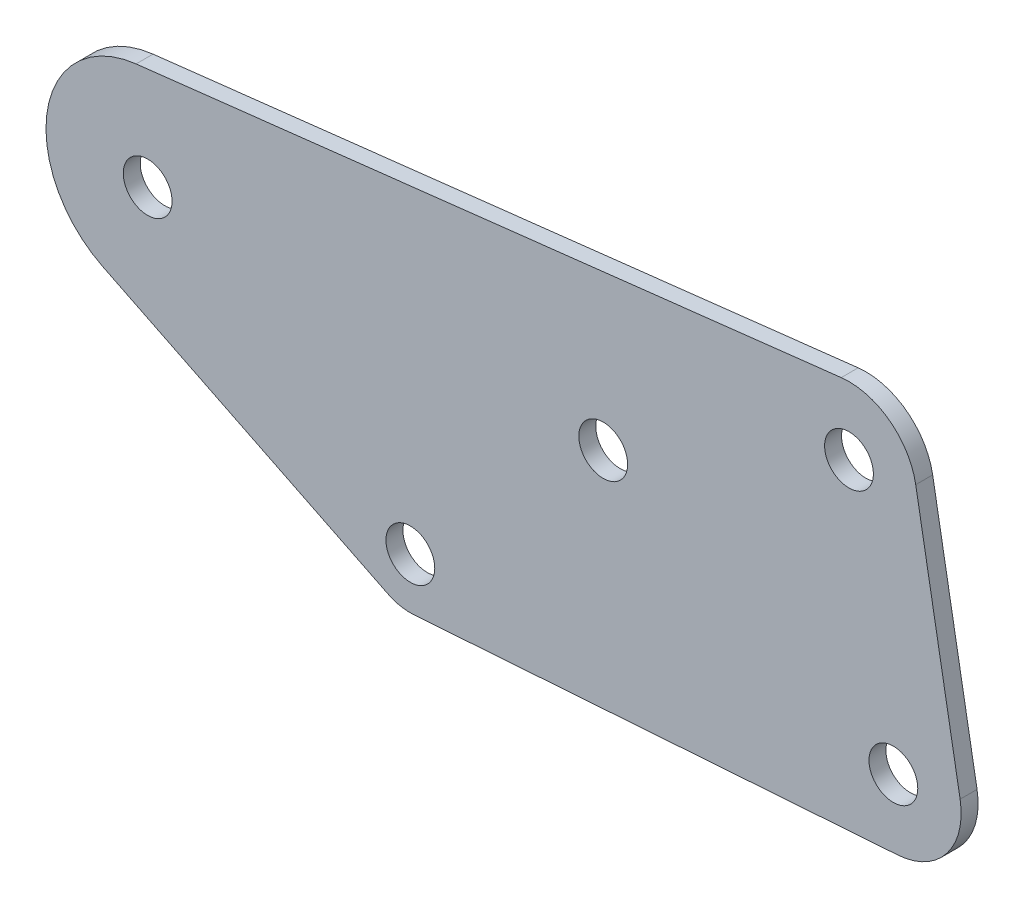
ISO-10303-21;
HEADER;
FILE_DESCRIPTION(('STEP AP214'),'2;1');
FILE_NAME('part.step','',(''),(''),'','','');
FILE_SCHEMA(('AUTOMOTIVE_DESIGN { 1 0 10303 214 1 1 1 1 }'));
ENDSEC;
DATA;
#1=APPLICATION_CONTEXT('core data for automotive mechanical design processes');
#2=APPLICATION_PROTOCOL_DEFINITION('international standard','automotive_design',2000,#1);
#3=PRODUCT_CONTEXT('',#1,'mechanical');
#4=PRODUCT('Part','Part','',(#3));
#5=PRODUCT_RELATED_PRODUCT_CATEGORY('part','',(#4));
#6=PRODUCT_DEFINITION_FORMATION('','',#4);
#7=PRODUCT_DEFINITION_CONTEXT('part definition',#1,'design');
#8=PRODUCT_DEFINITION('design','',#6,#7);
#9=PRODUCT_DEFINITION_SHAPE('','',#8);
#10=(LENGTH_UNIT() NAMED_UNIT(*) SI_UNIT(.MILLI.,.METRE.));
#11=(NAMED_UNIT(*) PLANE_ANGLE_UNIT() SI_UNIT($,.RADIAN.));
#12=(NAMED_UNIT(*) SI_UNIT($,.STERADIAN.) SOLID_ANGLE_UNIT());
#13=UNCERTAINTY_MEASURE_WITH_UNIT(LENGTH_MEASURE(1.E-05),#10,'distance_accuracy_value','');
#14=(GEOMETRIC_REPRESENTATION_CONTEXT(3) GLOBAL_UNCERTAINTY_ASSIGNED_CONTEXT((#13)) GLOBAL_UNIT_ASSIGNED_CONTEXT((#10,
#11,#12)) REPRESENTATION_CONTEXT('',''));
#15=CARTESIAN_POINT('',(0.,0.,0.));
#16=DIRECTION('',(0.,0.,1.));
#17=DIRECTION('',(1.,0.,0.));
#18=AXIS2_PLACEMENT_3D('',#15,#16,#17);
#19=CARTESIAN_POINT('',(0.,0.,-1.5875));
#20=DIRECTION('',(0.,0.,-1.));
#21=DIRECTION('',(1.,0.,0.));
#22=AXIS2_PLACEMENT_3D('',#19,#20,#21);
#23=PLANE('',#22);
#24=CARTESIAN_POINT('',(24.60625,-17.4625,-1.5875));
#25=DIRECTION('',(0.,0.,1.));
#26=DIRECTION('',(1.,0.,0.));
#27=AXIS2_PLACEMENT_3D('',#24,#25,#26);
#28=CIRCLE('',#27,2.286);
#29=CARTESIAN_POINT('',(26.89225,-17.4625,-1.5875));
#30=VERTEX_POINT('',#29);
#31=EDGE_CURVE('E358',#30,#30,#28,.T.);
#32=ORIENTED_EDGE('',*,*,#31,.T.);
#33=EDGE_LOOP('',(#32));
#34=FACE_BOUND('',#33,.T.);
#35=CARTESIAN_POINT('',(42.672,0.,-1.5875));
#36=DIRECTION('',(0.,0.,1.));
#37=DIRECTION('',(1.,0.,0.));
#38=AXIS2_PLACEMENT_3D('',#35,#36,#37);
#39=CIRCLE('',#38,2.286);
#40=CARTESIAN_POINT('',(44.958,0.,-1.5875));
#41=VERTEX_POINT('',#40);
#42=EDGE_CURVE('E371',#41,#41,#39,.T.);
#43=ORIENTED_EDGE('',*,*,#42,.T.);
#44=EDGE_LOOP('',(#43));
#45=FACE_BOUND('',#44,.T.);
#46=CARTESIAN_POINT('',(0.,0.,-1.5875));
#47=DIRECTION('',(0.,0.,1.));
#48=DIRECTION('',(1.,0.,0.));
#49=AXIS2_PLACEMENT_3D('',#46,#47,#48);
#50=CIRCLE('',#49,9.525);
#51=CARTESIAN_POINT('',(-1.08593683317859,9.46289417643176,-1.5875));
#52=VERTEX_POINT('',#51);
#53=CARTESIAN_POINT('',(-4.2174081296129,-8.5404387280909,-1.5875));
#54=VERTEX_POINT('',#53);
#55=EDGE_CURVE('E173',#52,#54,#50,.T.);
#56=ORIENTED_EDGE('',*,*,#55,.F.);
#57=DIRECTION('',(-0.993479703562389,-0.114009116344209,0.));
#58=VECTOR('',#57,1.);
#59=CARTESIAN_POINT('',(64.9682599019453,17.0430999658348,-1.5875));
#60=LINE('',#59,#58);
#61=CARTESIAN_POINT('',(64.9682599019453,17.0430999658348,-1.5875));
#62=VERTEX_POINT('',#61);
#63=EDGE_CURVE('E142',#62,#52,#60,.T.);
#64=ORIENTED_EDGE('',*,*,#63,.F.);
#65=CARTESIAN_POINT('',(65.692217790731,10.7345038482136,-1.5875));
#66=DIRECTION('',(0.,0.,1.));
#67=DIRECTION('',(1.,0.,0.));
#68=AXIS2_PLACEMENT_3D('',#65,#66,#67);
#69=CIRCLE('',#68,6.35);
#70=CARTESIAN_POINT('',(71.9445733431461,11.8438054511079,-1.5875));
#71=VERTEX_POINT('',#70);
#72=EDGE_CURVE('E122',#71,#62,#69,.T.);
#73=ORIENTED_EDGE('',*,*,#72,.F.);
#74=DIRECTION('',(-0.174693165810126,0.984622921640176,0.));
#75=VECTOR('',#74,1.);
#76=CARTESIAN_POINT('',(76.1023555524151,-11.5906983971057,-1.5875));
#77=LINE('',#76,#75);
#78=CARTESIAN_POINT('',(76.1023555524151,-11.5906983971057,-1.5875));
#79=VERTEX_POINT('',#78);
#80=EDGE_CURVE('E132',#79,#71,#77,.T.);
#81=ORIENTED_EDGE('',*,*,#80,.F.);
#82=CARTESIAN_POINT('',(69.85,-12.7,-1.5875));
#83=DIRECTION('',(0.,0.,1.));
#84=DIRECTION('',(-1.,0.,0.));
#85=AXIS2_PLACEMENT_3D('',#82,#83,#84);
#86=CIRCLE('',#85,6.35);
#87=CARTESIAN_POINT('',(70.2939782441774,-19.0344599863522,-1.5875));
#88=VERTEX_POINT('',#87);
#89=EDGE_CURVE('E138',#88,#79,#86,.T.);
#90=ORIENTED_EDGE('',*,*,#89,.F.);
#91=DIRECTION('',(0.997552753756252,0.0699178337287283,0.));
#92=VECTOR('',#91,1.);
#93=CARTESIAN_POINT('',(24.9392336831331,-22.2133449897641,-1.5875));
#94=LINE('',#93,#92);
#95=CARTESIAN_POINT('',(24.9392336831331,-22.2133449897641,-1.5875));
#96=VERTEX_POINT('',#95);
#97=EDGE_CURVE('E203',#96,#88,#94,.T.);
#98=ORIENTED_EDGE('',*,*,#97,.F.);
#99=CARTESIAN_POINT('',(24.60625,-17.4625,-1.5875));
#100=DIRECTION('',(0.,0.,1.));
#101=DIRECTION('',(1.,0.,0.));
#102=AXIS2_PLACEMENT_3D('',#99,#100,#101);
#103=CIRCLE('',#102,4.7625);
#104=CARTESIAN_POINT('',(22.4975459351936,-21.7327193640455,-1.5875));
#105=VERTEX_POINT('',#104);
#106=EDGE_CURVE('E195',#105,#96,#103,.T.);
#107=ORIENTED_EDGE('',*,*,#106,.F.);
#108=DIRECTION('',(0.896633987201145,-0.442772507045974,0.));
#109=VECTOR('',#108,1.);
#110=CARTESIAN_POINT('',(-4.2174081296129,-8.5404387280909,-1.5875));
#111=LINE('',#110,#109);
#112=EDGE_CURVE('E185',#54,#105,#111,.T.);
#113=ORIENTED_EDGE('',*,*,#112,.F.);
#114=EDGE_LOOP('',(#56,#64,#73,#81,#90,#98,#107,#113));
#115=FACE_BOUND('',#114,.T.);
#116=CARTESIAN_POINT('',(0.,0.,-1.5875));
#117=DIRECTION('',(0.,0.,1.));
#118=DIRECTION('',(1.,0.,0.));
#119=AXIS2_PLACEMENT_3D('',#116,#117,#118);
#120=CIRCLE('',#119,2.286);
#121=CARTESIAN_POINT('',(2.286,0.,-1.5875));
#122=VERTEX_POINT('',#121);
#123=EDGE_CURVE('E152',#122,#122,#120,.T.);
#124=ORIENTED_EDGE('',*,*,#123,.T.);
#125=EDGE_LOOP('',(#124));
#126=FACE_BOUND('',#125,.T.);
#127=CARTESIAN_POINT('',(65.692217790731,10.7345038482136,-1.5875));
#128=DIRECTION('',(0.,0.,1.));
#129=DIRECTION('',(1.,0.,0.));
#130=AXIS2_PLACEMENT_3D('',#127,#128,#129);
#131=CIRCLE('',#130,2.28599999999998);
#132=CARTESIAN_POINT('',(67.978217790731,10.7345038482136,-1.5875));
#133=VERTEX_POINT('',#132);
#134=EDGE_CURVE('E365',#133,#133,#131,.T.);
#135=ORIENTED_EDGE('',*,*,#134,.T.);
#136=EDGE_LOOP('',(#135));
#137=FACE_BOUND('',#136,.T.);
#138=CARTESIAN_POINT('',(69.85,-12.7,-1.5875));
#139=DIRECTION('',(0.,0.,1.));
#140=DIRECTION('',(1.,0.,0.));
#141=AXIS2_PLACEMENT_3D('',#138,#139,#140);
#142=CIRCLE('',#141,2.28599999999999);
#143=CARTESIAN_POINT('',(72.136,-12.7,-1.5875));
#144=VERTEX_POINT('',#143);
#145=EDGE_CURVE('E347',#144,#144,#142,.T.);
#146=ORIENTED_EDGE('',*,*,#145,.T.);
#147=EDGE_LOOP('',(#146));
#148=FACE_BOUND('',#147,.T.);
#149=ADVANCED_FACE('F45',(#34,#45,#115,#126,#137,#148),#23,.T.);
#150=CARTESIAN_POINT('',(0.,0.,0.));
#151=DIRECTION('',(0.,0.,-1.));
#152=DIRECTION('',(1.,0.,0.));
#153=AXIS2_PLACEMENT_3D('',#150,#151,#152);
#154=PLANE('',#153);
#155=CARTESIAN_POINT('',(0.,0.,0.));
#156=DIRECTION('',(0.,0.,1.));
#157=DIRECTION('',(1.,0.,0.));
#158=AXIS2_PLACEMENT_3D('',#155,#156,#157);
#159=CIRCLE('',#158,9.525);
#160=CARTESIAN_POINT('',(-1.08593683317859,9.46289417643176,0.));
#161=VERTEX_POINT('',#160);
#162=CARTESIAN_POINT('',(-4.2174081296129,-8.5404387280909,0.));
#163=VERTEX_POINT('',#162);
#164=EDGE_CURVE('E148',#161,#163,#159,.T.);
#165=ORIENTED_EDGE('',*,*,#164,.T.);
#166=DIRECTION('',(0.896633987201145,-0.442772507045974,0.));
#167=VECTOR('',#166,1.);
#168=CARTESIAN_POINT('',(-4.2174081296129,-8.5404387280909,0.));
#169=LINE('',#168,#167);
#170=CARTESIAN_POINT('',(22.4975459351936,-21.7327193640455,0.));
#171=VERTEX_POINT('',#170);
#172=EDGE_CURVE('E151',#163,#171,#169,.T.);
#173=ORIENTED_EDGE('',*,*,#172,.T.);
#174=CARTESIAN_POINT('',(24.60625,-17.4625,0.));
#175=DIRECTION('',(0.,0.,1.));
#176=DIRECTION('',(1.,0.,0.));
#177=AXIS2_PLACEMENT_3D('',#174,#175,#176);
#178=CIRCLE('',#177,4.7625);
#179=CARTESIAN_POINT('',(24.9392336831331,-22.2133449897641,0.));
#180=VERTEX_POINT('',#179);
#181=EDGE_CURVE('E156',#171,#180,#178,.T.);
#182=ORIENTED_EDGE('',*,*,#181,.T.);
#183=DIRECTION('',(0.997552753756252,0.0699178337287283,0.));
#184=VECTOR('',#183,1.);
#185=CARTESIAN_POINT('',(24.9392336831331,-22.2133449897641,0.));
#186=LINE('',#185,#184);
#187=CARTESIAN_POINT('',(70.2939782441774,-19.0344599863522,0.));
#188=VERTEX_POINT('',#187);
#189=EDGE_CURVE('E160',#180,#188,#186,.T.);
#190=ORIENTED_EDGE('',*,*,#189,.T.);
#191=CARTESIAN_POINT('',(69.85,-12.7,0.));
#192=DIRECTION('',(0.,0.,1.));
#193=DIRECTION('',(-1.,0.,0.));
#194=AXIS2_PLACEMENT_3D('',#191,#192,#193);
#195=CIRCLE('',#194,6.35);
#196=CARTESIAN_POINT('',(76.1023555524151,-11.5906983971057,0.));
#197=VERTEX_POINT('',#196);
#198=EDGE_CURVE('E164',#188,#197,#195,.T.);
#199=ORIENTED_EDGE('',*,*,#198,.T.);
#200=DIRECTION('',(-0.174693165810126,0.984622921640176,0.));
#201=VECTOR('',#200,1.);
#202=CARTESIAN_POINT('',(76.1023555524151,-11.5906983971057,0.));
#203=LINE('',#202,#201);
#204=CARTESIAN_POINT('',(71.9445733431461,11.8438054511079,0.));
#205=VERTEX_POINT('',#204);
#206=EDGE_CURVE('E167',#197,#205,#203,.T.);
#207=ORIENTED_EDGE('',*,*,#206,.T.);
#208=CARTESIAN_POINT('',(65.692217790731,10.7345038482136,0.));
#209=DIRECTION('',(0.,0.,1.));
#210=DIRECTION('',(1.,0.,0.));
#211=AXIS2_PLACEMENT_3D('',#208,#209,#210);
#212=CIRCLE('',#211,6.35);
#213=CARTESIAN_POINT('',(64.9682599019453,17.0430999658348,0.));
#214=VERTEX_POINT('',#213);
#215=EDGE_CURVE('E125',#205,#214,#212,.T.);
#216=ORIENTED_EDGE('',*,*,#215,.T.);
#217=DIRECTION('',(-0.993479703562389,-0.114009116344209,0.));
#218=VECTOR('',#217,1.);
#219=CARTESIAN_POINT('',(64.9682599019453,17.0430999658348,0.));
#220=LINE('',#219,#218);
#221=EDGE_CURVE('E170',#214,#161,#220,.T.);
#222=ORIENTED_EDGE('',*,*,#221,.T.);
#223=EDGE_LOOP('',(#165,#173,#182,#190,#199,#207,#216,#222));
#224=FACE_BOUND('',#223,.T.);
#225=CARTESIAN_POINT('',(0.,0.,0.));
#226=DIRECTION('',(0.,0.,1.));
#227=DIRECTION('',(1.,0.,0.));
#228=AXIS2_PLACEMENT_3D('',#225,#226,#227);
#229=CIRCLE('',#228,2.286);
#230=CARTESIAN_POINT('',(2.286,0.,0.));
#231=VERTEX_POINT('',#230);
#232=EDGE_CURVE('E198',#231,#231,#229,.T.);
#233=ORIENTED_EDGE('',*,*,#232,.F.);
#234=EDGE_LOOP('',(#233));
#235=FACE_BOUND('',#234,.T.);
#236=CARTESIAN_POINT('',(42.672,0.,0.));
#237=DIRECTION('',(0.,0.,1.));
#238=DIRECTION('',(1.,0.,0.));
#239=AXIS2_PLACEMENT_3D('',#236,#237,#238);
#240=CIRCLE('',#239,2.286);
#241=CARTESIAN_POINT('',(44.958,0.,0.));
#242=VERTEX_POINT('',#241);
#243=EDGE_CURVE('E368',#242,#242,#240,.T.);
#244=ORIENTED_EDGE('',*,*,#243,.F.);
#245=EDGE_LOOP('',(#244));
#246=FACE_BOUND('',#245,.T.);
#247=CARTESIAN_POINT('',(65.692217790731,10.7345038482136,0.));
#248=DIRECTION('',(0.,0.,1.));
#249=DIRECTION('',(1.,0.,0.));
#250=AXIS2_PLACEMENT_3D('',#247,#248,#249);
#251=CIRCLE('',#250,2.28599999999998);
#252=CARTESIAN_POINT('',(67.978217790731,10.7345038482136,0.));
#253=VERTEX_POINT('',#252);
#254=EDGE_CURVE('E361',#253,#253,#251,.T.);
#255=ORIENTED_EDGE('',*,*,#254,.F.);
#256=EDGE_LOOP('',(#255));
#257=FACE_BOUND('',#256,.T.);
#258=CARTESIAN_POINT('',(24.60625,-17.4625,0.));
#259=DIRECTION('',(0.,0.,1.));
#260=DIRECTION('',(1.,0.,0.));
#261=AXIS2_PLACEMENT_3D('',#258,#259,#260);
#262=CIRCLE('',#261,2.286);
#263=CARTESIAN_POINT('',(26.89225,-17.4625,0.));
#264=VERTEX_POINT('',#263);
#265=EDGE_CURVE('E355',#264,#264,#262,.T.);
#266=ORIENTED_EDGE('',*,*,#265,.F.);
#267=EDGE_LOOP('',(#266));
#268=FACE_BOUND('',#267,.T.);
#269=CARTESIAN_POINT('',(69.85,-12.7,0.));
#270=DIRECTION('',(0.,0.,1.));
#271=DIRECTION('',(1.,0.,0.));
#272=AXIS2_PLACEMENT_3D('',#269,#270,#271);
#273=CIRCLE('',#272,2.28599999999999);
#274=CARTESIAN_POINT('',(72.136,-12.7,0.));
#275=VERTEX_POINT('',#274);
#276=EDGE_CURVE('E350',#275,#275,#273,.T.);
#277=ORIENTED_EDGE('',*,*,#276,.F.);
#278=EDGE_LOOP('',(#277));
#279=FACE_BOUND('',#278,.T.);
#280=ADVANCED_FACE('F192',(#224,#235,#246,#257,#268,#279),#154,.F.);
#281=CARTESIAN_POINT('',(0.,0.,-1.5875));
#282=DIRECTION('',(0.,0.,1.));
#283=DIRECTION('',(-1.,0.,0.));
#284=AXIS2_PLACEMENT_3D('',#281,#282,#283);
#285=CYLINDRICAL_SURFACE('',#284,9.525);
#286=ORIENTED_EDGE('',*,*,#164,.F.);
#287=DIRECTION('',(0.,0.,1.));
#288=VECTOR('',#287,1.);
#289=CARTESIAN_POINT('',(-1.08593683317859,9.46289417643176,-1.5875));
#290=LINE('',#289,#288);
#291=EDGE_CURVE('E62',#52,#161,#290,.T.);
#292=ORIENTED_EDGE('',*,*,#291,.F.);
#293=ORIENTED_EDGE('',*,*,#55,.T.);
#294=DIRECTION('',(0.,0.,1.));
#295=VECTOR('',#294,1.);
#296=CARTESIAN_POINT('',(-4.2174081296129,-8.5404387280909,-1.5875));
#297=LINE('',#296,#295);
#298=EDGE_CURVE('E11',#54,#163,#297,.T.);
#299=ORIENTED_EDGE('',*,*,#298,.T.);
#300=EDGE_LOOP('',(#286,#292,#293,#299));
#301=FACE_BOUND('',#300,.T.);
#302=ADVANCED_FACE('F47',(#301),#285,.T.);
#303=CARTESIAN_POINT('',(-4.2174081296129,-8.5404387280909,-1.5875));
#304=DIRECTION('',(0.442772507045974,0.896633987201145,0.));
#305=DIRECTION('',(-0.896633987201145,0.442772507045974,0.));
#306=AXIS2_PLACEMENT_3D('',#303,#304,#305);
#307=PLANE('',#306);
#308=ORIENTED_EDGE('',*,*,#172,.F.);
#309=ORIENTED_EDGE('',*,*,#298,.F.);
#310=ORIENTED_EDGE('',*,*,#112,.T.);
#311=DIRECTION('',(0.,0.,1.));
#312=VECTOR('',#311,1.);
#313=CARTESIAN_POINT('',(22.4975459351936,-21.7327193640455,-1.5875));
#314=LINE('',#313,#312);
#315=EDGE_CURVE('E54',#105,#171,#314,.T.);
#316=ORIENTED_EDGE('',*,*,#315,.T.);
#317=EDGE_LOOP('',(#308,#309,#310,#316));
#318=FACE_BOUND('',#317,.T.);
#319=ADVANCED_FACE('F184',(#318),#307,.F.);
#320=CARTESIAN_POINT('',(24.60625,-17.4625,-1.5875));
#321=DIRECTION('',(0.,0.,1.));
#322=DIRECTION('',(-1.,0.,0.));
#323=AXIS2_PLACEMENT_3D('',#320,#321,#322);
#324=CYLINDRICAL_SURFACE('',#323,4.7625);
#325=ORIENTED_EDGE('',*,*,#181,.F.);
#326=ORIENTED_EDGE('',*,*,#315,.F.);
#327=ORIENTED_EDGE('',*,*,#106,.T.);
#328=DIRECTION('',(0.,0.,1.));
#329=VECTOR('',#328,1.);
#330=CARTESIAN_POINT('',(24.9392336831331,-22.2133449897641,-1.5875));
#331=LINE('',#330,#329);
#332=EDGE_CURVE('E179',#96,#180,#331,.T.);
#333=ORIENTED_EDGE('',*,*,#332,.T.);
#334=EDGE_LOOP('',(#325,#326,#327,#333));
#335=FACE_BOUND('',#334,.T.);
#336=ADVANCED_FACE('F189',(#335),#324,.T.);
#337=CARTESIAN_POINT('',(24.9392336831331,-22.2133449897641,-1.5875));
#338=DIRECTION('',(-0.0699178337287283,0.997552753756252,0.));
#339=DIRECTION('',(-0.997552753756252,-0.0699178337287283,0.));
#340=AXIS2_PLACEMENT_3D('',#337,#338,#339);
#341=PLANE('',#340);
#342=ORIENTED_EDGE('',*,*,#189,.F.);
#343=ORIENTED_EDGE('',*,*,#332,.F.);
#344=ORIENTED_EDGE('',*,*,#97,.T.);
#345=DIRECTION('',(0.,0.,1.));
#346=VECTOR('',#345,1.);
#347=CARTESIAN_POINT('',(70.2939782441774,-19.0344599863522,-1.5875));
#348=LINE('',#347,#346);
#349=EDGE_CURVE('E177',#88,#188,#348,.T.);
#350=ORIENTED_EDGE('',*,*,#349,.T.);
#351=EDGE_LOOP('',(#342,#343,#344,#350));
#352=FACE_BOUND('',#351,.T.);
#353=ADVANCED_FACE('F211',(#352),#341,.F.);
#354=CARTESIAN_POINT('',(69.85,-12.7,-1.5875));
#355=DIRECTION('',(0.,0.,1.));
#356=DIRECTION('',(-1.,0.,0.));
#357=AXIS2_PLACEMENT_3D('',#354,#355,#356);
#358=CYLINDRICAL_SURFACE('',#357,6.35);
#359=ORIENTED_EDGE('',*,*,#198,.F.);
#360=ORIENTED_EDGE('',*,*,#349,.F.);
#361=ORIENTED_EDGE('',*,*,#89,.T.);
#362=DIRECTION('',(0.,0.,1.));
#363=VECTOR('',#362,1.);
#364=CARTESIAN_POINT('',(76.1023555524151,-11.5906983971057,-1.5875));
#365=LINE('',#364,#363);
#366=EDGE_CURVE('E129',#79,#197,#365,.T.);
#367=ORIENTED_EDGE('',*,*,#366,.T.);
#368=EDGE_LOOP('',(#359,#360,#361,#367));
#369=FACE_BOUND('',#368,.T.);
#370=ADVANCED_FACE('F208',(#369),#358,.T.);
#371=CARTESIAN_POINT('',(76.1023555524151,-11.5906983971057,-1.5875));
#372=DIRECTION('',(-0.984622921640176,-0.174693165810125,0.));
#373=DIRECTION('',(0.174693165810126,-0.984622921640176,0.));
#374=AXIS2_PLACEMENT_3D('',#371,#372,#373);
#375=PLANE('',#374);
#376=ORIENTED_EDGE('',*,*,#206,.F.);
#377=ORIENTED_EDGE('',*,*,#366,.F.);
#378=ORIENTED_EDGE('',*,*,#80,.T.);
#379=DIRECTION('',(0.,0.,1.));
#380=VECTOR('',#379,1.);
#381=CARTESIAN_POINT('',(71.9445733431461,11.8438054511079,-1.5875));
#382=LINE('',#381,#380);
#383=EDGE_CURVE('E118',#71,#205,#382,.T.);
#384=ORIENTED_EDGE('',*,*,#383,.T.);
#385=EDGE_LOOP('',(#376,#377,#378,#384));
#386=FACE_BOUND('',#385,.T.);
#387=ADVANCED_FACE('F133',(#386),#375,.F.);
#388=CARTESIAN_POINT('',(65.692217790731,10.7345038482136,-1.5875));
#389=DIRECTION('',(0.,0.,1.));
#390=DIRECTION('',(-1.,0.,0.));
#391=AXIS2_PLACEMENT_3D('',#388,#389,#390);
#392=CYLINDRICAL_SURFACE('',#391,6.35);
#393=ORIENTED_EDGE('',*,*,#215,.F.);
#394=ORIENTED_EDGE('',*,*,#383,.F.);
#395=ORIENTED_EDGE('',*,*,#72,.T.);
#396=DIRECTION('',(0.,0.,1.));
#397=VECTOR('',#396,1.);
#398=CARTESIAN_POINT('',(64.9682599019453,17.0430999658348,-1.5875));
#399=LINE('',#398,#397);
#400=EDGE_CURVE('E92',#62,#214,#399,.T.);
#401=ORIENTED_EDGE('',*,*,#400,.T.);
#402=EDGE_LOOP('',(#393,#394,#395,#401));
#403=FACE_BOUND('',#402,.T.);
#404=ADVANCED_FACE('F120',(#403),#392,.T.);
#405=CARTESIAN_POINT('',(64.9682599019453,17.0430999658348,-1.5875));
#406=DIRECTION('',(0.114009116344209,-0.993479703562389,0.));
#407=DIRECTION('',(0.993479703562389,0.114009116344209,0.));
#408=AXIS2_PLACEMENT_3D('',#405,#406,#407);
#409=PLANE('',#408);
#410=ORIENTED_EDGE('',*,*,#221,.F.);
#411=ORIENTED_EDGE('',*,*,#400,.F.);
#412=ORIENTED_EDGE('',*,*,#63,.T.);
#413=ORIENTED_EDGE('',*,*,#291,.T.);
#414=EDGE_LOOP('',(#410,#411,#412,#413));
#415=FACE_BOUND('',#414,.T.);
#416=ADVANCED_FACE('F233',(#415),#409,.F.);
#417=CARTESIAN_POINT('',(0.,0.,-1.5875));
#418=DIRECTION('',(0.,0.,1.));
#419=DIRECTION('',(-1.,0.,0.));
#420=AXIS2_PLACEMENT_3D('',#417,#418,#419);
#421=CYLINDRICAL_SURFACE('',#420,2.286);
#422=ORIENTED_EDGE('',*,*,#123,.F.);
#423=EDGE_LOOP('',(#422));
#424=FACE_BOUND('',#423,.T.);
#425=ORIENTED_EDGE('',*,*,#232,.T.);
#426=EDGE_LOOP('',(#425));
#427=FACE_BOUND('',#426,.T.);
#428=ADVANCED_FACE('F230',(#424,#427),#421,.F.);
#429=CARTESIAN_POINT('',(42.672,0.,-1.5875));
#430=DIRECTION('',(0.,0.,1.));
#431=DIRECTION('',(-1.,0.,0.));
#432=AXIS2_PLACEMENT_3D('',#429,#430,#431);
#433=CYLINDRICAL_SURFACE('',#432,2.286);
#434=ORIENTED_EDGE('',*,*,#42,.F.);
#435=EDGE_LOOP('',(#434));
#436=FACE_BOUND('',#435,.T.);
#437=ORIENTED_EDGE('',*,*,#243,.T.);
#438=EDGE_LOOP('',(#437));
#439=FACE_BOUND('',#438,.T.);
#440=ADVANCED_FACE('F260',(#436,#439),#433,.F.);
#441=CARTESIAN_POINT('',(65.692217790731,10.7345038482136,-1.5875));
#442=DIRECTION('',(0.,0.,1.));
#443=DIRECTION('',(-1.,0.,0.));
#444=AXIS2_PLACEMENT_3D('',#441,#442,#443);
#445=CYLINDRICAL_SURFACE('',#444,2.28599999999998);
#446=ORIENTED_EDGE('',*,*,#134,.F.);
#447=EDGE_LOOP('',(#446));
#448=FACE_BOUND('',#447,.T.);
#449=ORIENTED_EDGE('',*,*,#254,.T.);
#450=EDGE_LOOP('',(#449));
#451=FACE_BOUND('',#450,.T.);
#452=ADVANCED_FACE('F268',(#448,#451),#445,.F.);
#453=CARTESIAN_POINT('',(24.60625,-17.4625,-1.5875));
#454=DIRECTION('',(0.,0.,1.));
#455=DIRECTION('',(-1.,0.,0.));
#456=AXIS2_PLACEMENT_3D('',#453,#454,#455);
#457=CYLINDRICAL_SURFACE('',#456,2.286);
#458=ORIENTED_EDGE('',*,*,#31,.F.);
#459=EDGE_LOOP('',(#458));
#460=FACE_BOUND('',#459,.T.);
#461=ORIENTED_EDGE('',*,*,#265,.T.);
#462=EDGE_LOOP('',(#461));
#463=FACE_BOUND('',#462,.T.);
#464=ADVANCED_FACE('F276',(#460,#463),#457,.F.);
#465=CARTESIAN_POINT('',(69.85,-12.7,-1.5875));
#466=DIRECTION('',(0.,0.,1.));
#467=DIRECTION('',(-1.,0.,0.));
#468=AXIS2_PLACEMENT_3D('',#465,#466,#467);
#469=CYLINDRICAL_SURFACE('',#468,2.28599999999999);
#470=ORIENTED_EDGE('',*,*,#145,.F.);
#471=EDGE_LOOP('',(#470));
#472=FACE_BOUND('',#471,.T.);
#473=ORIENTED_EDGE('',*,*,#276,.T.);
#474=EDGE_LOOP('',(#473));
#475=FACE_BOUND('',#474,.T.);
#476=ADVANCED_FACE('F285',(#472,#475),#469,.F.);
#477=CLOSED_SHELL('',(#149,#280,#302,#319,#336,#353,#370,#387,#404,#416,#428,#440,#452,#464,#476));
#478=MANIFOLD_SOLID_BREP('B2',#477);
#479=ADVANCED_BREP_SHAPE_REPRESENTATION('',(#18,#478),#14);
#480=SHAPE_DEFINITION_REPRESENTATION(#9,#479);
ENDSEC;
END-ISO-10303-21;
